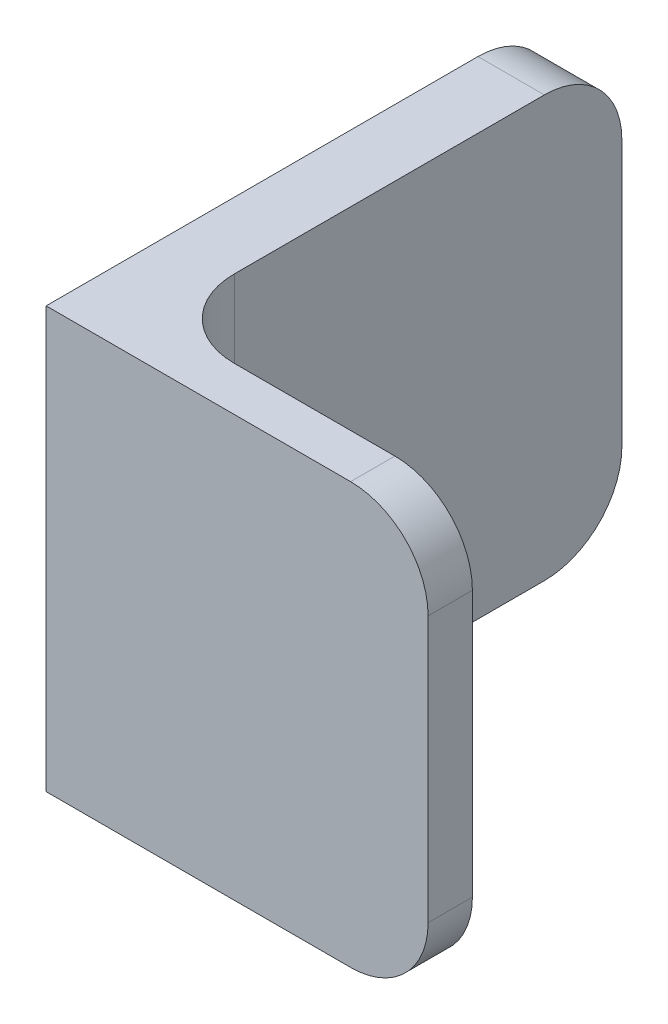
ISO-10303-21;
HEADER;
FILE_DESCRIPTION(('STEP AP214'),'2;1');
FILE_NAME('part.step','',(''),(''),'','','');
FILE_SCHEMA(('AUTOMOTIVE_DESIGN { 1 0 10303 214 1 1 1 1 }'));
ENDSEC;
DATA;
#1=APPLICATION_CONTEXT('core data for automotive mechanical design processes');
#2=APPLICATION_PROTOCOL_DEFINITION('international standard','automotive_design',2000,#1);
#3=PRODUCT_CONTEXT('',#1,'mechanical');
#4=PRODUCT('Part','Part','',(#3));
#5=PRODUCT_RELATED_PRODUCT_CATEGORY('part','',(#4));
#6=PRODUCT_DEFINITION_FORMATION('','',#4);
#7=PRODUCT_DEFINITION_CONTEXT('part definition',#1,'design');
#8=PRODUCT_DEFINITION('design','',#6,#7);
#9=PRODUCT_DEFINITION_SHAPE('','',#8);
#10=(LENGTH_UNIT() NAMED_UNIT(*) SI_UNIT(.MILLI.,.METRE.));
#11=(NAMED_UNIT(*) PLANE_ANGLE_UNIT() SI_UNIT($,.RADIAN.));
#12=(NAMED_UNIT(*) SI_UNIT($,.STERADIAN.) SOLID_ANGLE_UNIT());
#13=UNCERTAINTY_MEASURE_WITH_UNIT(LENGTH_MEASURE(1.E-05),#10,'distance_accuracy_value','');
#14=(GEOMETRIC_REPRESENTATION_CONTEXT(3) GLOBAL_UNCERTAINTY_ASSIGNED_CONTEXT((#13)) GLOBAL_UNIT_ASSIGNED_CONTEXT((#10,
#11,#12)) REPRESENTATION_CONTEXT('',''));
#15=CARTESIAN_POINT('',(0.,0.,0.));
#16=DIRECTION('',(0.,0.,1.));
#17=DIRECTION('',(1.,0.,0.));
#18=AXIS2_PLACEMENT_3D('',#15,#16,#17);
#19=CARTESIAN_POINT('',(34.5,38.,0.));
#20=DIRECTION('',(0.,0.,-1.));
#21=DIRECTION('',(-1.,0.,0.));
#22=AXIS2_PLACEMENT_3D('',#19,#20,#21);
#23=PLANE('',#22);
#24=DIRECTION('',(1.,0.,0.));
#25=VECTOR('',#24,1.);
#26=CARTESIAN_POINT('',(34.5,0.,0.));
#27=LINE('',#26,#25);
#28=CARTESIAN_POINT('',(0.,0.,0.));
#29=VERTEX_POINT('',#28);
#30=CARTESIAN_POINT('',(27.5,0.,0.));
#31=VERTEX_POINT('',#30);
#32=EDGE_CURVE('E163',#29,#31,#27,.T.);
#33=ORIENTED_EDGE('',*,*,#32,.T.);
#34=CARTESIAN_POINT('',(27.5,7.,0.));
#35=DIRECTION('',(0.,0.,-1.));
#36=DIRECTION('',(-1.,0.,0.));
#37=AXIS2_PLACEMENT_3D('',#34,#35,#36);
#38=CIRCLE('',#37,7.);
#39=CARTESIAN_POINT('',(34.5,7.,0.));
#40=VERTEX_POINT('',#39);
#41=EDGE_CURVE('E55',#31,#40,#38,.F.);
#42=ORIENTED_EDGE('',*,*,#41,.T.);
#43=DIRECTION('',(0.,-1.,0.));
#44=VECTOR('',#43,1.);
#45=CARTESIAN_POINT('',(34.5,38.,0.));
#46=LINE('',#45,#44);
#47=CARTESIAN_POINT('',(34.5,31.,0.));
#48=VERTEX_POINT('',#47);
#49=EDGE_CURVE('E183',#48,#40,#46,.T.);
#50=ORIENTED_EDGE('',*,*,#49,.F.);
#51=CARTESIAN_POINT('',(27.5,31.,0.));
#52=DIRECTION('',(0.,0.,-1.));
#53=DIRECTION('',(-1.,0.,0.));
#54=AXIS2_PLACEMENT_3D('',#51,#52,#53);
#55=CIRCLE('',#54,7.);
#56=CARTESIAN_POINT('',(27.5,38.,0.));
#57=VERTEX_POINT('',#56);
#58=EDGE_CURVE('E150',#48,#57,#55,.F.);
#59=ORIENTED_EDGE('',*,*,#58,.T.);
#60=DIRECTION('',(1.,0.,0.));
#61=VECTOR('',#60,1.);
#62=CARTESIAN_POINT('',(34.5,38.,0.));
#63=LINE('',#62,#61);
#64=CARTESIAN_POINT('',(0.,38.,0.));
#65=VERTEX_POINT('',#64);
#66=EDGE_CURVE('E131',#65,#57,#63,.T.);
#67=ORIENTED_EDGE('',*,*,#66,.F.);
#68=DIRECTION('',(0.,-1.,0.));
#69=VECTOR('',#68,1.);
#70=CARTESIAN_POINT('',(0.,38.,0.));
#71=LINE('',#70,#69);
#72=EDGE_CURVE('E137',#65,#29,#71,.T.);
#73=ORIENTED_EDGE('',*,*,#72,.T.);
#74=EDGE_LOOP('',(#33,#42,#50,#59,#67,#73));
#75=FACE_BOUND('',#74,.T.);
#76=ADVANCED_FACE('F39',(#75),#23,.F.);
#77=CARTESIAN_POINT('',(34.5,38.,-4.));
#78=DIRECTION('',(-1.,0.,0.));
#79=DIRECTION('',(0.,0.,1.));
#80=AXIS2_PLACEMENT_3D('',#77,#78,#79);
#81=PLANE('',#80);
#82=ORIENTED_EDGE('',*,*,#49,.T.);
#83=DIRECTION('',(0.,0.,-1.));
#84=VECTOR('',#83,1.);
#85=CARTESIAN_POINT('',(34.5,7.,-4.));
#86=LINE('',#85,#84);
#87=CARTESIAN_POINT('',(34.5,7.,-4.));
#88=VERTEX_POINT('',#87);
#89=EDGE_CURVE('E222',#40,#88,#86,.T.);
#90=ORIENTED_EDGE('',*,*,#89,.T.);
#91=DIRECTION('',(0.,-1.,0.));
#92=VECTOR('',#91,1.);
#93=CARTESIAN_POINT('',(34.5,38.,-4.));
#94=LINE('',#93,#92);
#95=CARTESIAN_POINT('',(34.5,31.,-4.));
#96=VERTEX_POINT('',#95);
#97=EDGE_CURVE('E179',#96,#88,#94,.T.);
#98=ORIENTED_EDGE('',*,*,#97,.F.);
#99=DIRECTION('',(0.,0.,-1.));
#100=VECTOR('',#99,1.);
#101=CARTESIAN_POINT('',(34.5,31.,-4.));
#102=LINE('',#101,#100);
#103=EDGE_CURVE('E62',#96,#48,#102,.F.);
#104=ORIENTED_EDGE('',*,*,#103,.T.);
#105=EDGE_LOOP('',(#82,#90,#98,#104));
#106=FACE_BOUND('',#105,.T.);
#107=ADVANCED_FACE('F271',(#106),#81,.F.);
#108=CARTESIAN_POINT('',(6.00000000000001,38.,-4.));
#109=DIRECTION('',(0.,0.,1.));
#110=DIRECTION('',(1.,0.,0.));
#111=AXIS2_PLACEMENT_3D('',#108,#109,#110);
#112=PLANE('',#111);
#113=ORIENTED_EDGE('',*,*,#97,.T.);
#114=CARTESIAN_POINT('',(27.5,7.,-4.));
#115=DIRECTION('',(0.,0.,1.));
#116=DIRECTION('',(1.,0.,0.));
#117=AXIS2_PLACEMENT_3D('',#114,#115,#116);
#118=CIRCLE('',#117,7.);
#119=CARTESIAN_POINT('',(27.5,0.,-4.));
#120=VERTEX_POINT('',#119);
#121=EDGE_CURVE('E232',#88,#120,#118,.F.);
#122=ORIENTED_EDGE('',*,*,#121,.T.);
#123=DIRECTION('',(-1.,0.,0.));
#124=VECTOR('',#123,1.);
#125=CARTESIAN_POINT('',(6.00000000000001,0.,-4.));
#126=LINE('',#125,#124);
#127=CARTESIAN_POINT('',(13.,0.,-4.));
#128=VERTEX_POINT('',#127);
#129=EDGE_CURVE('E166',#120,#128,#126,.T.);
#130=ORIENTED_EDGE('',*,*,#129,.T.);
#131=DIRECTION('',(0.,-1.,0.));
#132=VECTOR('',#131,1.);
#133=CARTESIAN_POINT('',(13.,38.,-4.));
#134=LINE('',#133,#132);
#135=CARTESIAN_POINT('',(13.,38.,-4.));
#136=VERTEX_POINT('',#135);
#137=EDGE_CURVE('E229',#128,#136,#134,.F.);
#138=ORIENTED_EDGE('',*,*,#137,.T.);
#139=DIRECTION('',(-1.,0.,0.));
#140=VECTOR('',#139,1.);
#141=CARTESIAN_POINT('',(6.00000000000001,38.,-4.));
#142=LINE('',#141,#140);
#143=CARTESIAN_POINT('',(27.5,38.,-4.));
#144=VERTEX_POINT('',#143);
#145=EDGE_CURVE('E152',#144,#136,#142,.T.);
#146=ORIENTED_EDGE('',*,*,#145,.F.);
#147=CARTESIAN_POINT('',(27.5,31.,-4.));
#148=DIRECTION('',(0.,0.,1.));
#149=DIRECTION('',(1.,0.,0.));
#150=AXIS2_PLACEMENT_3D('',#147,#148,#149);
#151=CIRCLE('',#150,7.);
#152=EDGE_CURVE('E226',#144,#96,#151,.F.);
#153=ORIENTED_EDGE('',*,*,#152,.T.);
#154=EDGE_LOOP('',(#113,#122,#130,#138,#146,#153));
#155=FACE_BOUND('',#154,.T.);
#156=ADVANCED_FACE('F248',(#155),#112,.F.);
#157=CARTESIAN_POINT('',(6.,38.,-46.));
#158=DIRECTION('',(-1.,0.,0.));
#159=DIRECTION('',(0.,0.,1.));
#160=AXIS2_PLACEMENT_3D('',#157,#158,#159);
#161=PLANE('',#160);
#162=DIRECTION('',(0.,0.,-1.));
#163=VECTOR('',#162,1.);
#164=CARTESIAN_POINT('',(6.,0.,-46.));
#165=LINE('',#164,#163);
#166=CARTESIAN_POINT('',(6.,0.,-11.));
#167=VERTEX_POINT('',#166);
#168=CARTESIAN_POINT('',(6.,0.,-39.));
#169=VERTEX_POINT('',#168);
#170=EDGE_CURVE('E158',#167,#169,#165,.T.);
#171=ORIENTED_EDGE('',*,*,#170,.T.);
#172=CARTESIAN_POINT('',(6.,7.,-39.));
#173=DIRECTION('',(-1.,0.,0.));
#174=DIRECTION('',(0.,0.,1.));
#175=AXIS2_PLACEMENT_3D('',#172,#173,#174);
#176=CIRCLE('',#175,7.);
#177=CARTESIAN_POINT('',(6.,7.,-46.));
#178=VERTEX_POINT('',#177);
#179=EDGE_CURVE('E212',#169,#178,#176,.F.);
#180=ORIENTED_EDGE('',*,*,#179,.T.);
#181=DIRECTION('',(0.,-1.,0.));
#182=VECTOR('',#181,1.);
#183=CARTESIAN_POINT('',(6.,38.,-46.));
#184=LINE('',#183,#182);
#185=CARTESIAN_POINT('',(6.,31.,-46.));
#186=VERTEX_POINT('',#185);
#187=EDGE_CURVE('E175',#186,#178,#184,.T.);
#188=ORIENTED_EDGE('',*,*,#187,.F.);
#189=CARTESIAN_POINT('',(6.,31.,-39.));
#190=DIRECTION('',(-1.,0.,0.));
#191=DIRECTION('',(0.,0.,1.));
#192=AXIS2_PLACEMENT_3D('',#189,#190,#191);
#193=CIRCLE('',#192,7.);
#194=CARTESIAN_POINT('',(6.,38.,-39.));
#195=VERTEX_POINT('',#194);
#196=EDGE_CURVE('E209',#186,#195,#193,.F.);
#197=ORIENTED_EDGE('',*,*,#196,.T.);
#198=DIRECTION('',(0.,0.,-1.));
#199=VECTOR('',#198,1.);
#200=CARTESIAN_POINT('',(6.,38.,-46.));
#201=LINE('',#200,#199);
#202=CARTESIAN_POINT('',(6.,38.,-11.));
#203=VERTEX_POINT('',#202);
#204=EDGE_CURVE('E138',#203,#195,#201,.T.);
#205=ORIENTED_EDGE('',*,*,#204,.F.);
#206=DIRECTION('',(0.,-1.,0.));
#207=VECTOR('',#206,1.);
#208=CARTESIAN_POINT('',(6.,0.,-11.));
#209=LINE('',#208,#207);
#210=EDGE_CURVE('E205',#203,#167,#209,.T.);
#211=ORIENTED_EDGE('',*,*,#210,.T.);
#212=EDGE_LOOP('',(#171,#180,#188,#197,#205,#211));
#213=FACE_BOUND('',#212,.T.);
#214=ADVANCED_FACE('F254',(#213),#161,.F.);
#215=CARTESIAN_POINT('',(0.,38.,-46.));
#216=DIRECTION('',(0.,0.,1.));
#217=DIRECTION('',(1.,0.,0.));
#218=AXIS2_PLACEMENT_3D('',#215,#216,#217);
#219=PLANE('',#218);
#220=ORIENTED_EDGE('',*,*,#187,.T.);
#221=DIRECTION('',(-1.,0.,0.));
#222=VECTOR('',#221,1.);
#223=CARTESIAN_POINT('',(0.,7.,-46.));
#224=LINE('',#223,#222);
#225=CARTESIAN_POINT('',(0.,7.,-46.));
#226=VERTEX_POINT('',#225);
#227=EDGE_CURVE('E189',#178,#226,#224,.T.);
#228=ORIENTED_EDGE('',*,*,#227,.T.);
#229=DIRECTION('',(0.,-1.,0.));
#230=VECTOR('',#229,1.);
#231=CARTESIAN_POINT('',(0.,38.,-46.));
#232=LINE('',#231,#230);
#233=CARTESIAN_POINT('',(0.,31.,-46.));
#234=VERTEX_POINT('',#233);
#235=EDGE_CURVE('E147',#234,#226,#232,.T.);
#236=ORIENTED_EDGE('',*,*,#235,.F.);
#237=DIRECTION('',(-1.,0.,0.));
#238=VECTOR('',#237,1.);
#239=CARTESIAN_POINT('',(0.,31.,-46.));
#240=LINE('',#239,#238);
#241=EDGE_CURVE('E186',#234,#186,#240,.F.);
#242=ORIENTED_EDGE('',*,*,#241,.T.);
#243=EDGE_LOOP('',(#220,#228,#236,#242));
#244=FACE_BOUND('',#243,.T.);
#245=ADVANCED_FACE('F262',(#244),#219,.F.);
#246=CARTESIAN_POINT('',(0.,38.,0.));
#247=DIRECTION('',(1.,0.,0.));
#248=DIRECTION('',(0.,0.,-1.));
#249=AXIS2_PLACEMENT_3D('',#246,#247,#248);
#250=PLANE('',#249);
#251=ORIENTED_EDGE('',*,*,#235,.T.);
#252=CARTESIAN_POINT('',(0.,7.,-39.));
#253=DIRECTION('',(1.,0.,0.));
#254=DIRECTION('',(0.,0.,-1.));
#255=AXIS2_PLACEMENT_3D('',#252,#253,#254);
#256=CIRCLE('',#255,7.);
#257=CARTESIAN_POINT('',(0.,0.,-39.));
#258=VERTEX_POINT('',#257);
#259=EDGE_CURVE('E196',#226,#258,#256,.F.);
#260=ORIENTED_EDGE('',*,*,#259,.T.);
#261=DIRECTION('',(0.,0.,1.));
#262=VECTOR('',#261,1.);
#263=CARTESIAN_POINT('',(0.,0.,0.));
#264=LINE('',#263,#262);
#265=EDGE_CURVE('E144',#258,#29,#264,.T.);
#266=ORIENTED_EDGE('',*,*,#265,.T.);
#267=ORIENTED_EDGE('',*,*,#72,.F.);
#268=DIRECTION('',(0.,0.,1.));
#269=VECTOR('',#268,1.);
#270=CARTESIAN_POINT('',(0.,38.,0.));
#271=LINE('',#270,#269);
#272=CARTESIAN_POINT('',(0.,38.,-39.));
#273=VERTEX_POINT('',#272);
#274=EDGE_CURVE('E125',#273,#65,#271,.T.);
#275=ORIENTED_EDGE('',*,*,#274,.F.);
#276=CARTESIAN_POINT('',(0.,31.,-39.));
#277=DIRECTION('',(1.,0.,0.));
#278=DIRECTION('',(0.,0.,-1.));
#279=AXIS2_PLACEMENT_3D('',#276,#277,#278);
#280=CIRCLE('',#279,7.);
#281=EDGE_CURVE('E193',#273,#234,#280,.F.);
#282=ORIENTED_EDGE('',*,*,#281,.T.);
#283=EDGE_LOOP('',(#251,#260,#266,#267,#275,#282));
#284=FACE_BOUND('',#283,.T.);
#285=ADVANCED_FACE('F142',(#284),#250,.F.);
#286=CARTESIAN_POINT('',(0.,38.,0.));
#287=DIRECTION('',(0.,-1.,0.));
#288=DIRECTION('',(0.,0.,-1.));
#289=AXIS2_PLACEMENT_3D('',#286,#287,#288);
#290=PLANE('',#289);
#291=ORIENTED_EDGE('',*,*,#204,.T.);
#292=DIRECTION('',(-1.,0.,0.));
#293=VECTOR('',#292,1.);
#294=CARTESIAN_POINT('',(0.,38.,-39.));
#295=LINE('',#294,#293);
#296=EDGE_CURVE('E134',#195,#273,#295,.T.);
#297=ORIENTED_EDGE('',*,*,#296,.T.);
#298=ORIENTED_EDGE('',*,*,#274,.T.);
#299=ORIENTED_EDGE('',*,*,#66,.T.);
#300=DIRECTION('',(0.,0.,-1.));
#301=VECTOR('',#300,1.);
#302=CARTESIAN_POINT('',(27.5,38.,0.));
#303=LINE('',#302,#301);
#304=EDGE_CURVE('E215',#57,#144,#303,.T.);
#305=ORIENTED_EDGE('',*,*,#304,.T.);
#306=ORIENTED_EDGE('',*,*,#145,.T.);
#307=CARTESIAN_POINT('',(13.,38.,-11.));
#308=DIRECTION('',(0.,-1.,0.));
#309=DIRECTION('',(0.,0.,-1.));
#310=AXIS2_PLACEMENT_3D('',#307,#308,#309);
#311=CIRCLE('',#310,7.);
#312=EDGE_CURVE('E11',#136,#203,#311,.T.);
#313=ORIENTED_EDGE('',*,*,#312,.T.);
#314=EDGE_LOOP('',(#291,#297,#298,#299,#305,#306,#313));
#315=FACE_BOUND('',#314,.T.);
#316=ADVANCED_FACE('F128',(#315),#290,.F.);
#317=CARTESIAN_POINT('',(0.,0.,0.));
#318=DIRECTION('',(0.,-1.,0.));
#319=DIRECTION('',(0.,0.,-1.));
#320=AXIS2_PLACEMENT_3D('',#317,#318,#319);
#321=PLANE('',#320);
#322=ORIENTED_EDGE('',*,*,#265,.F.);
#323=DIRECTION('',(-1.,0.,0.));
#324=VECTOR('',#323,1.);
#325=CARTESIAN_POINT('',(6.,0.,-39.));
#326=LINE('',#325,#324);
#327=EDGE_CURVE('E202',#258,#169,#326,.F.);
#328=ORIENTED_EDGE('',*,*,#327,.T.);
#329=ORIENTED_EDGE('',*,*,#170,.F.);
#330=CARTESIAN_POINT('',(13.,0.,-11.));
#331=DIRECTION('',(0.,-1.,0.));
#332=DIRECTION('',(0.,0.,-1.));
#333=AXIS2_PLACEMENT_3D('',#330,#331,#332);
#334=CIRCLE('',#333,7.);
#335=EDGE_CURVE('E48',#167,#128,#334,.F.);
#336=ORIENTED_EDGE('',*,*,#335,.T.);
#337=ORIENTED_EDGE('',*,*,#129,.F.);
#338=DIRECTION('',(0.,0.,-1.));
#339=VECTOR('',#338,1.);
#340=CARTESIAN_POINT('',(27.5,0.,0.));
#341=LINE('',#340,#339);
#342=EDGE_CURVE('E199',#120,#31,#341,.F.);
#343=ORIENTED_EDGE('',*,*,#342,.T.);
#344=ORIENTED_EDGE('',*,*,#32,.F.);
#345=EDGE_LOOP('',(#322,#328,#329,#336,#337,#343,#344));
#346=FACE_BOUND('',#345,.T.);
#347=ADVANCED_FACE('F242',(#346),#321,.T.);
#348=CARTESIAN_POINT('',(0.,7.,-39.));
#349=DIRECTION('',(1.,0.,0.));
#350=DIRECTION('',(0.,0.,-1.));
#351=AXIS2_PLACEMENT_3D('',#348,#349,#350);
#352=CYLINDRICAL_SURFACE('',#351,7.);
#353=ORIENTED_EDGE('',*,*,#179,.F.);
#354=ORIENTED_EDGE('',*,*,#327,.F.);
#355=ORIENTED_EDGE('',*,*,#259,.F.);
#356=ORIENTED_EDGE('',*,*,#227,.F.);
#357=EDGE_LOOP('',(#353,#354,#355,#356));
#358=FACE_BOUND('',#357,.T.);
#359=ADVANCED_FACE('F266',(#358),#352,.T.);
#360=CARTESIAN_POINT('',(0.,31.,-39.));
#361=DIRECTION('',(-1.,0.,0.));
#362=DIRECTION('',(0.,0.,1.));
#363=AXIS2_PLACEMENT_3D('',#360,#361,#362);
#364=CYLINDRICAL_SURFACE('',#363,7.);
#365=ORIENTED_EDGE('',*,*,#196,.F.);
#366=ORIENTED_EDGE('',*,*,#241,.F.);
#367=ORIENTED_EDGE('',*,*,#281,.F.);
#368=ORIENTED_EDGE('',*,*,#296,.F.);
#369=EDGE_LOOP('',(#365,#366,#367,#368));
#370=FACE_BOUND('',#369,.T.);
#371=ADVANCED_FACE('F259',(#370),#364,.T.);
#372=CARTESIAN_POINT('',(27.5,7.,-4.));
#373=DIRECTION('',(0.,0.,1.));
#374=DIRECTION('',(1.,0.,0.));
#375=AXIS2_PLACEMENT_3D('',#372,#373,#374);
#376=CYLINDRICAL_SURFACE('',#375,7.);
#377=ORIENTED_EDGE('',*,*,#41,.F.);
#378=ORIENTED_EDGE('',*,*,#342,.F.);
#379=ORIENTED_EDGE('',*,*,#121,.F.);
#380=ORIENTED_EDGE('',*,*,#89,.F.);
#381=EDGE_LOOP('',(#377,#378,#379,#380));
#382=FACE_BOUND('',#381,.T.);
#383=ADVANCED_FACE('F270',(#382),#376,.T.);
#384=CARTESIAN_POINT('',(13.,38.,-11.));
#385=DIRECTION('',(0.,1.,0.));
#386=DIRECTION('',(0.,0.,1.));
#387=AXIS2_PLACEMENT_3D('',#384,#385,#386);
#388=CYLINDRICAL_SURFACE('',#387,7.);
#389=ORIENTED_EDGE('',*,*,#312,.F.);
#390=ORIENTED_EDGE('',*,*,#137,.F.);
#391=ORIENTED_EDGE('',*,*,#335,.F.);
#392=ORIENTED_EDGE('',*,*,#210,.F.);
#393=EDGE_LOOP('',(#389,#390,#391,#392));
#394=FACE_BOUND('',#393,.T.);
#395=ADVANCED_FACE('F251',(#394),#388,.F.);
#396=CARTESIAN_POINT('',(27.5,31.,0.));
#397=DIRECTION('',(0.,0.,-1.));
#398=DIRECTION('',(-1.,0.,0.));
#399=AXIS2_PLACEMENT_3D('',#396,#397,#398);
#400=CYLINDRICAL_SURFACE('',#399,7.);
#401=ORIENTED_EDGE('',*,*,#58,.F.);
#402=ORIENTED_EDGE('',*,*,#103,.F.);
#403=ORIENTED_EDGE('',*,*,#152,.F.);
#404=ORIENTED_EDGE('',*,*,#304,.F.);
#405=EDGE_LOOP('',(#401,#402,#403,#404));
#406=FACE_BOUND('',#405,.T.);
#407=ADVANCED_FACE('F41',(#406),#400,.T.);
#408=CLOSED_SHELL('',(#76,#107,#156,#214,#245,#285,#316,#347,#359,#371,#383,#395,#407));
#409=MANIFOLD_SOLID_BREP('B2',#408);
#410=ADVANCED_BREP_SHAPE_REPRESENTATION('',(#18,#409),#14);
#411=SHAPE_DEFINITION_REPRESENTATION(#9,#410);
ENDSEC;
END-ISO-10303-21;
